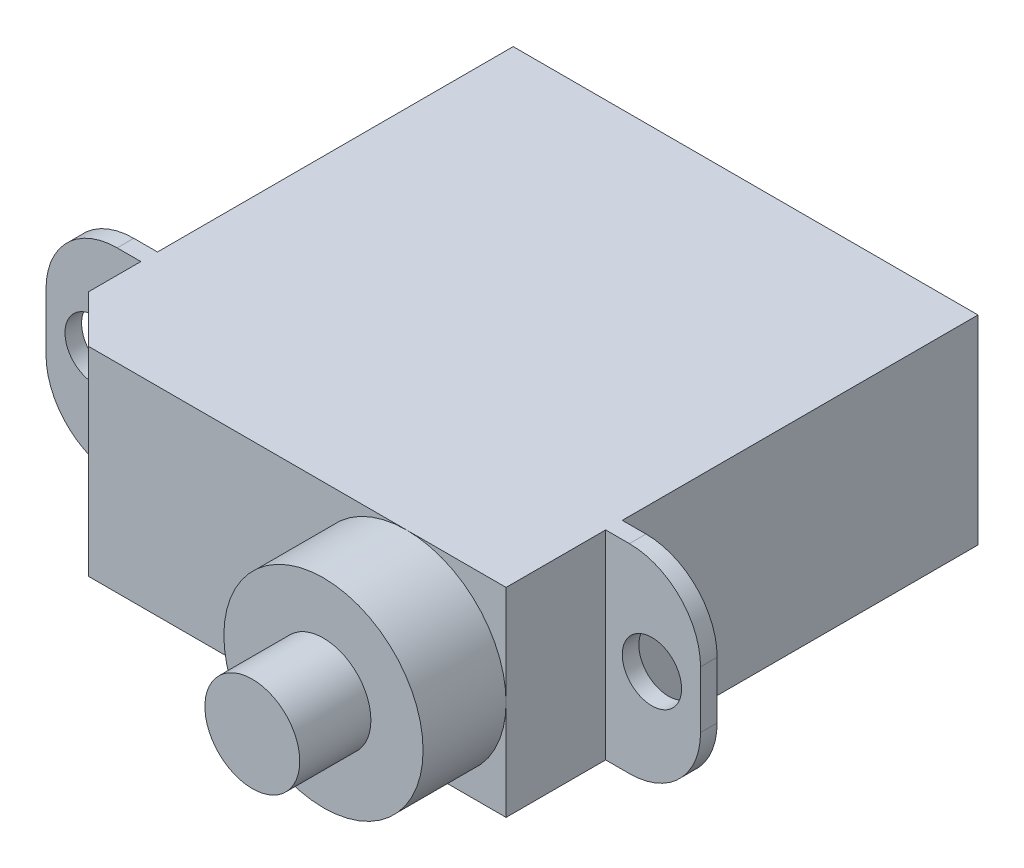
ISO-10303-21;
HEADER;
FILE_DESCRIPTION(('STEP AP214'),'2;1');
FILE_NAME('part.step','',(''),(''),'','','');
FILE_SCHEMA(('AUTOMOTIVE_DESIGN { 1 0 10303 214 1 1 1 1 }'));
ENDSEC;
DATA;
#1=APPLICATION_CONTEXT('core data for automotive mechanical design processes');
#2=APPLICATION_PROTOCOL_DEFINITION('international standard','automotive_design',2000,#1);
#3=PRODUCT_CONTEXT('',#1,'mechanical');
#4=PRODUCT('Part','Part','',(#3));
#5=PRODUCT_RELATED_PRODUCT_CATEGORY('part','',(#4));
#6=PRODUCT_DEFINITION_FORMATION('','',#4);
#7=PRODUCT_DEFINITION_CONTEXT('part definition',#1,'design');
#8=PRODUCT_DEFINITION('design','',#6,#7);
#9=PRODUCT_DEFINITION_SHAPE('','',#8);
#10=(LENGTH_UNIT() NAMED_UNIT(*) SI_UNIT(.MILLI.,.METRE.));
#11=(NAMED_UNIT(*) PLANE_ANGLE_UNIT() SI_UNIT($,.RADIAN.));
#12=(NAMED_UNIT(*) SI_UNIT($,.STERADIAN.) SOLID_ANGLE_UNIT());
#13=UNCERTAINTY_MEASURE_WITH_UNIT(LENGTH_MEASURE(1.E-05),#10,'distance_accuracy_value','');
#14=(GEOMETRIC_REPRESENTATION_CONTEXT(3) GLOBAL_UNCERTAINTY_ASSIGNED_CONTEXT((#13)) GLOBAL_UNIT_ASSIGNED_CONTEXT((#10,
#11,#12)) REPRESENTATION_CONTEXT('',''));
#15=CARTESIAN_POINT('',(0.,0.,0.));
#16=DIRECTION('',(0.,0.,1.));
#17=DIRECTION('',(1.,0.,0.));
#18=AXIS2_PLACEMENT_3D('',#15,#16,#17);
#19=CARTESIAN_POINT('',(5.6,0.,23.4));
#20=DIRECTION('',(0.,0.,1.));
#21=DIRECTION('',(1.,0.,0.));
#22=AXIS2_PLACEMENT_3D('',#19,#20,#21);
#23=PLANE('',#22);
#24=CARTESIAN_POINT('',(5.6,0.,23.4));
#25=DIRECTION('',(0.,0.,1.));
#26=DIRECTION('',(1.,0.,0.));
#27=AXIS2_PLACEMENT_3D('',#24,#25,#26);
#28=CIRCLE('',#27,4.2);
#29=CARTESIAN_POINT('',(9.8,0.,23.4));
#30=VERTEX_POINT('',#29);
#31=EDGE_CURVE('E184',#30,#30,#28,.T.);
#32=ORIENTED_EDGE('',*,*,#31,.T.);
#33=EDGE_LOOP('',(#32));
#34=FACE_BOUND('',#33,.T.);
#35=CARTESIAN_POINT('',(5.6,0.,23.4));
#36=DIRECTION('',(0.,0.,1.));
#37=DIRECTION('',(1.,0.,0.));
#38=AXIS2_PLACEMENT_3D('',#35,#36,#37);
#39=CIRCLE('',#38,2.);
#40=CARTESIAN_POINT('',(7.6,0.,23.4));
#41=VERTEX_POINT('',#40);
#42=EDGE_CURVE('E617',#41,#41,#39,.T.);
#43=ORIENTED_EDGE('',*,*,#42,.F.);
#44=EDGE_LOOP('',(#43));
#45=FACE_BOUND('',#44,.T.);
#46=ADVANCED_FACE('F33',(#34,#45),#23,.T.);
#47=CARTESIAN_POINT('',(9.8,-4.2,19.9));
#48=DIRECTION('',(0.,0.,1.));
#49=DIRECTION('',(1.,0.,0.));
#50=AXIS2_PLACEMENT_3D('',#47,#48,#49);
#51=PLANE('',#50);
#52=CARTESIAN_POINT('',(5.6,0.,19.9));
#53=DIRECTION('',(0.,0.,1.));
#54=DIRECTION('',(1.,0.,0.));
#55=AXIS2_PLACEMENT_3D('',#52,#53,#54);
#56=CIRCLE('',#55,4.2);
#57=CARTESIAN_POINT('',(9.8,0.,19.9));
#58=VERTEX_POINT('',#57);
#59=CARTESIAN_POINT('',(5.6,4.2,19.9));
#60=VERTEX_POINT('',#59);
#61=EDGE_CURVE('E44',#58,#60,#56,.T.);
#62=ORIENTED_EDGE('',*,*,#61,.F.);
#63=DIRECTION('',(0.,1.,0.));
#64=VECTOR('',#63,1.);
#65=CARTESIAN_POINT('',(9.8,4.2,19.9));
#66=LINE('',#65,#64);
#67=CARTESIAN_POINT('',(9.8,4.2,19.9));
#68=VERTEX_POINT('',#67);
#69=EDGE_CURVE('E168',#58,#68,#66,.T.);
#70=ORIENTED_EDGE('',*,*,#69,.T.);
#71=DIRECTION('',(-1.,0.,0.));
#72=VECTOR('',#71,1.);
#73=CARTESIAN_POINT('',(-9.8,4.2,19.9));
#74=LINE('',#73,#72);
#75=EDGE_CURVE('E182',#68,#60,#74,.T.);
#76=ORIENTED_EDGE('',*,*,#75,.T.);
#77=EDGE_LOOP('',(#62,#70,#76));
#78=FACE_BOUND('',#77,.T.);
#79=ADVANCED_FACE('F181',(#78),#51,.T.);
#80=CARTESIAN_POINT('',(5.6,-4.2,19.9));
#81=VERTEX_POINT('',#80);
#82=EDGE_CURVE('E11',#60,#81,#56,.T.);
#83=ORIENTED_EDGE('',*,*,#82,.F.);
#84=CARTESIAN_POINT('',(-7.80000000000001,4.2,19.9));
#85=VERTEX_POINT('',#84);
#86=EDGE_CURVE('E167',#60,#85,#74,.T.);
#87=ORIENTED_EDGE('',*,*,#86,.T.);
#88=DIRECTION('',(0.,-1.,0.));
#89=VECTOR('',#88,1.);
#90=CARTESIAN_POINT('',(-7.80000000000001,-4.2,19.9));
#91=LINE('',#90,#89);
#92=CARTESIAN_POINT('',(-7.80000000000001,-4.2,19.9));
#93=VERTEX_POINT('',#92);
#94=EDGE_CURVE('E264',#85,#93,#91,.T.);
#95=ORIENTED_EDGE('',*,*,#94,.T.);
#96=DIRECTION('',(1.,0.,0.));
#97=VECTOR('',#96,1.);
#98=CARTESIAN_POINT('',(-9.8,-4.2,19.9));
#99=LINE('',#98,#97);
#100=EDGE_CURVE('E239',#93,#81,#99,.T.);
#101=ORIENTED_EDGE('',*,*,#100,.T.);
#102=EDGE_LOOP('',(#83,#87,#95,#101));
#103=FACE_BOUND('',#102,.T.);
#104=ADVANCED_FACE('F381',(#103),#51,.T.);
#105=CARTESIAN_POINT('',(9.8,4.2,19.9));
#106=DIRECTION('',(-1.,0.,0.));
#107=DIRECTION('',(0.,-1.,0.));
#108=AXIS2_PLACEMENT_3D('',#105,#106,#107);
#109=PLANE('',#108);
#110=DIRECTION('',(0.,0.,-1.));
#111=VECTOR('',#110,1.);
#112=CARTESIAN_POINT('',(9.8,4.2,19.9));
#113=LINE('',#112,#111);
#114=CARTESIAN_POINT('',(9.8,4.2,15.));
#115=VERTEX_POINT('',#114);
#116=CARTESIAN_POINT('',(9.8,4.2,0.));
#117=VERTEX_POINT('',#116);
#118=EDGE_CURVE('E262',#115,#117,#113,.T.);
#119=ORIENTED_EDGE('',*,*,#118,.F.);
#120=DIRECTION('',(0.,-1.,0.));
#121=VECTOR('',#120,1.);
#122=CARTESIAN_POINT('',(9.8,4.2,15.));
#123=LINE('',#122,#121);
#124=CARTESIAN_POINT('',(9.79999999999999,-4.2,15.));
#125=VERTEX_POINT('',#124);
#126=EDGE_CURVE('E234',#115,#125,#123,.T.);
#127=ORIENTED_EDGE('',*,*,#126,.T.);
#128=DIRECTION('',(0.,0.,-1.));
#129=VECTOR('',#128,1.);
#130=CARTESIAN_POINT('',(9.8,-4.2,19.9));
#131=LINE('',#130,#129);
#132=CARTESIAN_POINT('',(9.8,-4.2,0.));
#133=VERTEX_POINT('',#132);
#134=EDGE_CURVE('E241',#125,#133,#131,.T.);
#135=ORIENTED_EDGE('',*,*,#134,.T.);
#136=DIRECTION('',(0.,1.,0.));
#137=VECTOR('',#136,1.);
#138=CARTESIAN_POINT('',(9.8,4.2,0.));
#139=LINE('',#138,#137);
#140=EDGE_CURVE('E236',#133,#117,#139,.T.);
#141=ORIENTED_EDGE('',*,*,#140,.T.);
#142=EDGE_LOOP('',(#119,#127,#135,#141));
#143=FACE_BOUND('',#142,.T.);
#144=ADVANCED_FACE('F358',(#143),#109,.F.);
#145=CARTESIAN_POINT('',(-9.8,4.2,19.9));
#146=DIRECTION('',(1.,0.,0.));
#147=DIRECTION('',(0.,1.,0.));
#148=AXIS2_PLACEMENT_3D('',#145,#146,#147);
#149=PLANE('',#148);
#150=DIRECTION('',(0.,0.,-1.));
#151=VECTOR('',#150,1.);
#152=CARTESIAN_POINT('',(-9.8,-4.2,19.9));
#153=LINE('',#152,#151);
#154=CARTESIAN_POINT('',(-9.8,-4.2,15.));
#155=VERTEX_POINT('',#154);
#156=CARTESIAN_POINT('',(-9.8,-4.2,0.));
#157=VERTEX_POINT('',#156);
#158=EDGE_CURVE('E254',#155,#157,#153,.T.);
#159=ORIENTED_EDGE('',*,*,#158,.F.);
#160=DIRECTION('',(0.,1.,0.));
#161=VECTOR('',#160,1.);
#162=CARTESIAN_POINT('',(-9.8,4.2,15.));
#163=LINE('',#162,#161);
#164=CARTESIAN_POINT('',(-9.8,4.2,15.));
#165=VERTEX_POINT('',#164);
#166=EDGE_CURVE('E231',#155,#165,#163,.T.);
#167=ORIENTED_EDGE('',*,*,#166,.T.);
#168=DIRECTION('',(0.,0.,-1.));
#169=VECTOR('',#168,1.);
#170=CARTESIAN_POINT('',(-9.8,4.2,19.9));
#171=LINE('',#170,#169);
#172=CARTESIAN_POINT('',(-9.8,4.2,0.));
#173=VERTEX_POINT('',#172);
#174=EDGE_CURVE('E258',#165,#173,#171,.T.);
#175=ORIENTED_EDGE('',*,*,#174,.T.);
#176=DIRECTION('',(0.,-1.,0.));
#177=VECTOR('',#176,1.);
#178=CARTESIAN_POINT('',(-9.8,4.2,0.));
#179=LINE('',#178,#177);
#180=EDGE_CURVE('E247',#173,#157,#179,.T.);
#181=ORIENTED_EDGE('',*,*,#180,.T.);
#182=EDGE_LOOP('',(#159,#167,#175,#181));
#183=FACE_BOUND('',#182,.T.);
#184=ADVANCED_FACE('F350',(#183),#149,.F.);
#185=CARTESIAN_POINT('',(9.8,-4.2,19.9));
#186=VERTEX_POINT('',#185);
#187=CARTESIAN_POINT('',(9.79999999999999,-4.2,15.7));
#188=VERTEX_POINT('',#187);
#189=EDGE_CURVE('E252',#186,#188,#131,.T.);
#190=ORIENTED_EDGE('',*,*,#189,.T.);
#191=DIRECTION('',(0.,1.,0.));
#192=VECTOR('',#191,1.);
#193=CARTESIAN_POINT('',(9.8,4.2,15.7));
#194=LINE('',#193,#192);
#195=CARTESIAN_POINT('',(9.8,4.2,15.7));
#196=VERTEX_POINT('',#195);
#197=EDGE_CURVE('E229',#188,#196,#194,.T.);
#198=ORIENTED_EDGE('',*,*,#197,.T.);
#199=EDGE_CURVE('E175',#68,#196,#113,.T.);
#200=ORIENTED_EDGE('',*,*,#199,.F.);
#201=ORIENTED_EDGE('',*,*,#69,.F.);
#202=EDGE_CURVE('E160',#186,#58,#66,.T.);
#203=ORIENTED_EDGE('',*,*,#202,.F.);
#204=EDGE_LOOP('',(#190,#198,#200,#201,#203));
#205=FACE_BOUND('',#204,.T.);
#206=ADVANCED_FACE('F172',(#205),#109,.F.);
#207=CARTESIAN_POINT('',(-9.8,4.2,19.9));
#208=DIRECTION('',(0.,-1.,0.));
#209=DIRECTION('',(0.,0.,-1.));
#210=AXIS2_PLACEMENT_3D('',#207,#208,#209);
#211=PLANE('',#210);
#212=DIRECTION('',(1.,0.,0.));
#213=VECTOR('',#212,1.);
#214=CARTESIAN_POINT('',(-13.8,4.2,15.7));
#215=LINE('',#214,#213);
#216=CARTESIAN_POINT('',(10.8,4.2,15.7));
#217=VERTEX_POINT('',#216);
#218=EDGE_CURVE('E206',#196,#217,#215,.T.);
#219=ORIENTED_EDGE('',*,*,#218,.T.);
#220=DIRECTION('',(0.,0.,-1.));
#221=VECTOR('',#220,1.);
#222=CARTESIAN_POINT('',(10.8,4.2,15.));
#223=LINE('',#222,#221);
#224=CARTESIAN_POINT('',(10.8,4.2,15.));
#225=VERTEX_POINT('',#224);
#226=EDGE_CURVE('E277',#217,#225,#223,.T.);
#227=ORIENTED_EDGE('',*,*,#226,.T.);
#228=DIRECTION('',(-1.,0.,0.));
#229=VECTOR('',#228,1.);
#230=CARTESIAN_POINT('',(-13.8,4.2,15.));
#231=LINE('',#230,#229);
#232=EDGE_CURVE('E204',#225,#115,#231,.T.);
#233=ORIENTED_EDGE('',*,*,#232,.T.);
#234=ORIENTED_EDGE('',*,*,#118,.T.);
#235=DIRECTION('',(-1.,0.,0.));
#236=VECTOR('',#235,1.);
#237=CARTESIAN_POINT('',(-9.8,4.2,0.));
#238=LINE('',#237,#236);
#239=EDGE_CURVE('E244',#117,#173,#238,.T.);
#240=ORIENTED_EDGE('',*,*,#239,.T.);
#241=ORIENTED_EDGE('',*,*,#174,.F.);
#242=CARTESIAN_POINT('',(-10.8,4.2,15.));
#243=VERTEX_POINT('',#242);
#244=EDGE_CURVE('E207',#165,#243,#231,.T.);
#245=ORIENTED_EDGE('',*,*,#244,.T.);
#246=DIRECTION('',(0.,0.,1.));
#247=VECTOR('',#246,1.);
#248=CARTESIAN_POINT('',(-10.8,4.2,15.7));
#249=LINE('',#248,#247);
#250=CARTESIAN_POINT('',(-10.8,4.2,15.7));
#251=VERTEX_POINT('',#250);
#252=EDGE_CURVE('E274',#243,#251,#249,.T.);
#253=ORIENTED_EDGE('',*,*,#252,.T.);
#254=CARTESIAN_POINT('',(-9.8,4.2,15.7));
#255=VERTEX_POINT('',#254);
#256=EDGE_CURVE('E225',#251,#255,#215,.T.);
#257=ORIENTED_EDGE('',*,*,#256,.T.);
#258=CARTESIAN_POINT('',(-9.8,4.2,17.9));
#259=VERTEX_POINT('',#258);
#260=EDGE_CURVE('E259',#259,#255,#171,.T.);
#261=ORIENTED_EDGE('',*,*,#260,.F.);
#262=DIRECTION('',(0.707106781186546,0.,0.707106781186549));
#263=VECTOR('',#262,1.);
#264=CARTESIAN_POINT('',(-7.80000000000001,4.2,19.9));
#265=LINE('',#264,#263);
#266=EDGE_CURVE('E271',#259,#85,#265,.T.);
#267=ORIENTED_EDGE('',*,*,#266,.T.);
#268=ORIENTED_EDGE('',*,*,#86,.F.);
#269=ORIENTED_EDGE('',*,*,#75,.F.);
#270=ORIENTED_EDGE('',*,*,#199,.T.);
#271=EDGE_LOOP('',(#219,#227,#233,#234,#240,#241,#245,#253,#257,#261,#267,#268,#269,#270));
#272=FACE_BOUND('',#271,.T.);
#273=ADVANCED_FACE('F340',(#272),#211,.F.);
#274=ORIENTED_EDGE('',*,*,#260,.T.);
#275=DIRECTION('',(0.,-1.,0.));
#276=VECTOR('',#275,1.);
#277=CARTESIAN_POINT('',(-9.8,4.2,15.7));
#278=LINE('',#277,#276);
#279=CARTESIAN_POINT('',(-9.8,-4.2,15.7));
#280=VERTEX_POINT('',#279);
#281=EDGE_CURVE('E227',#255,#280,#278,.T.);
#282=ORIENTED_EDGE('',*,*,#281,.T.);
#283=CARTESIAN_POINT('',(-9.8,-4.2,17.9));
#284=VERTEX_POINT('',#283);
#285=EDGE_CURVE('E255',#284,#280,#153,.T.);
#286=ORIENTED_EDGE('',*,*,#285,.F.);
#287=DIRECTION('',(0.,1.,0.));
#288=VECTOR('',#287,1.);
#289=CARTESIAN_POINT('',(-9.8,4.2,17.9));
#290=LINE('',#289,#288);
#291=EDGE_CURVE('E269',#284,#259,#290,.T.);
#292=ORIENTED_EDGE('',*,*,#291,.T.);
#293=EDGE_LOOP('',(#274,#282,#286,#292));
#294=FACE_BOUND('',#293,.T.);
#295=ADVANCED_FACE('F332',(#294),#149,.F.);
#296=CARTESIAN_POINT('',(-9.8,-4.2,19.9));
#297=DIRECTION('',(0.,1.,0.));
#298=DIRECTION('',(0.,0.,1.));
#299=AXIS2_PLACEMENT_3D('',#296,#297,#298);
#300=PLANE('',#299);
#301=DIRECTION('',(1.,0.,0.));
#302=VECTOR('',#301,1.);
#303=CARTESIAN_POINT('',(-13.8,-4.2,15.));
#304=LINE('',#303,#302);
#305=CARTESIAN_POINT('',(10.8,-4.2,15.));
#306=VERTEX_POINT('',#305);
#307=EDGE_CURVE('E210',#125,#306,#304,.T.);
#308=ORIENTED_EDGE('',*,*,#307,.T.);
#309=DIRECTION('',(0.,0.,1.));
#310=VECTOR('',#309,1.);
#311=CARTESIAN_POINT('',(10.8,-4.2,15.7));
#312=LINE('',#311,#310);
#313=CARTESIAN_POINT('',(10.8,-4.2,15.7));
#314=VERTEX_POINT('',#313);
#315=EDGE_CURVE('E295',#306,#314,#312,.T.);
#316=ORIENTED_EDGE('',*,*,#315,.T.);
#317=DIRECTION('',(-1.,0.,0.));
#318=VECTOR('',#317,1.);
#319=CARTESIAN_POINT('',(-13.8,-4.2,15.7));
#320=LINE('',#319,#318);
#321=EDGE_CURVE('E208',#314,#188,#320,.T.);
#322=ORIENTED_EDGE('',*,*,#321,.T.);
#323=ORIENTED_EDGE('',*,*,#189,.F.);
#324=EDGE_CURVE('E163',#81,#186,#99,.T.);
#325=ORIENTED_EDGE('',*,*,#324,.F.);
#326=ORIENTED_EDGE('',*,*,#100,.F.);
#327=DIRECTION('',(-0.707106781186546,0.,-0.707106781186549));
#328=VECTOR('',#327,1.);
#329=CARTESIAN_POINT('',(-7.80000000000001,-4.2,19.9));
#330=LINE('',#329,#328);
#331=EDGE_CURVE('E267',#93,#284,#330,.T.);
#332=ORIENTED_EDGE('',*,*,#331,.T.);
#333=ORIENTED_EDGE('',*,*,#285,.T.);
#334=CARTESIAN_POINT('',(-10.8,-4.2,15.7));
#335=VERTEX_POINT('',#334);
#336=EDGE_CURVE('E201',#280,#335,#320,.T.);
#337=ORIENTED_EDGE('',*,*,#336,.T.);
#338=DIRECTION('',(0.,0.,-1.));
#339=VECTOR('',#338,1.);
#340=CARTESIAN_POINT('',(-10.8,-4.2,15.));
#341=LINE('',#340,#339);
#342=CARTESIAN_POINT('',(-10.8,-4.2,15.));
#343=VERTEX_POINT('',#342);
#344=EDGE_CURVE('E292',#335,#343,#341,.T.);
#345=ORIENTED_EDGE('',*,*,#344,.T.);
#346=EDGE_CURVE('E211',#343,#155,#304,.T.);
#347=ORIENTED_EDGE('',*,*,#346,.T.);
#348=ORIENTED_EDGE('',*,*,#158,.T.);
#349=DIRECTION('',(1.,0.,0.));
#350=VECTOR('',#349,1.);
#351=CARTESIAN_POINT('',(-9.8,-4.2,0.));
#352=LINE('',#351,#350);
#353=EDGE_CURVE('E179',#157,#133,#352,.T.);
#354=ORIENTED_EDGE('',*,*,#353,.T.);
#355=ORIENTED_EDGE('',*,*,#134,.F.);
#356=EDGE_LOOP('',(#308,#316,#322,#323,#325,#326,#332,#333,#337,#345,#347,#348,#354,#355));
#357=FACE_BOUND('',#356,.T.);
#358=ADVANCED_FACE('F327',(#357),#300,.F.);
#359=EDGE_CURVE('E42',#81,#58,#56,.T.);
#360=ORIENTED_EDGE('',*,*,#359,.F.);
#361=ORIENTED_EDGE('',*,*,#324,.T.);
#362=ORIENTED_EDGE('',*,*,#202,.T.);
#363=EDGE_LOOP('',(#360,#361,#362));
#364=FACE_BOUND('',#363,.T.);
#365=ADVANCED_FACE('F162',(#364),#51,.T.);
#366=CARTESIAN_POINT('',(9.8,-4.2,0.));
#367=DIRECTION('',(0.,0.,1.));
#368=DIRECTION('',(1.,0.,0.));
#369=AXIS2_PLACEMENT_3D('',#366,#367,#368);
#370=PLANE('',#369);
#371=ORIENTED_EDGE('',*,*,#140,.F.);
#372=ORIENTED_EDGE('',*,*,#353,.F.);
#373=ORIENTED_EDGE('',*,*,#180,.F.);
#374=ORIENTED_EDGE('',*,*,#239,.F.);
#375=EDGE_LOOP('',(#371,#372,#373,#374));
#376=FACE_BOUND('',#375,.T.);
#377=ADVANCED_FACE('F355',(#376),#370,.F.);
#378=CARTESIAN_POINT('',(-7.80000000000001,-4.2,19.9));
#379=DIRECTION('',(-0.707106781186549,0.,0.707106781186546));
#380=DIRECTION('',(0.707106781186546,0.,0.707106781186549));
#381=AXIS2_PLACEMENT_3D('',#378,#379,#380);
#382=PLANE('',#381);
#383=ORIENTED_EDGE('',*,*,#266,.F.);
#384=ORIENTED_EDGE('',*,*,#291,.F.);
#385=ORIENTED_EDGE('',*,*,#331,.F.);
#386=ORIENTED_EDGE('',*,*,#94,.F.);
#387=EDGE_LOOP('',(#383,#384,#385,#386));
#388=FACE_BOUND('',#387,.T.);
#389=ADVANCED_FACE('F336',(#388),#382,.T.);
#390=CARTESIAN_POINT('',(-13.8,31.808875384557,15.7));
#391=DIRECTION('',(-1.,0.,0.));
#392=DIRECTION('',(0.,0.,1.));
#393=AXIS2_PLACEMENT_3D('',#390,#391,#392);
#394=PLANE('',#393);
#395=DIRECTION('',(0.,-1.,0.));
#396=VECTOR('',#395,1.);
#397=CARTESIAN_POINT('',(-13.8,31.808875384557,15.7));
#398=LINE('',#397,#396);
#399=CARTESIAN_POINT('',(-13.8,1.2,15.7));
#400=VERTEX_POINT('',#399);
#401=CARTESIAN_POINT('',(-13.8,-1.2,15.7));
#402=VERTEX_POINT('',#401);
#403=EDGE_CURVE('E220',#400,#402,#398,.T.);
#404=ORIENTED_EDGE('',*,*,#403,.F.);
#405=DIRECTION('',(0.,0.,1.));
#406=VECTOR('',#405,1.);
#407=CARTESIAN_POINT('',(-13.8,1.2,15.));
#408=LINE('',#407,#406);
#409=CARTESIAN_POINT('',(-13.8,1.2,15.));
#410=VERTEX_POINT('',#409);
#411=EDGE_CURVE('E304',#400,#410,#408,.F.);
#412=ORIENTED_EDGE('',*,*,#411,.T.);
#413=DIRECTION('',(0.,-1.,0.));
#414=VECTOR('',#413,1.);
#415=CARTESIAN_POINT('',(-13.8,31.808875384557,15.));
#416=LINE('',#415,#414);
#417=CARTESIAN_POINT('',(-13.8,-1.2,15.));
#418=VERTEX_POINT('',#417);
#419=EDGE_CURVE('E217',#410,#418,#416,.T.);
#420=ORIENTED_EDGE('',*,*,#419,.T.);
#421=DIRECTION('',(0.,0.,-1.));
#422=VECTOR('',#421,1.);
#423=CARTESIAN_POINT('',(-13.8,-1.2,15.7));
#424=LINE('',#423,#422);
#425=EDGE_CURVE('E302',#418,#402,#424,.F.);
#426=ORIENTED_EDGE('',*,*,#425,.T.);
#427=EDGE_LOOP('',(#404,#412,#420,#426));
#428=FACE_BOUND('',#427,.T.);
#429=ADVANCED_FACE('F316',(#428),#394,.T.);
#430=CARTESIAN_POINT('',(-13.8,31.808875384557,15.7));
#431=DIRECTION('',(0.,0.,1.));
#432=DIRECTION('',(1.,0.,0.));
#433=AXIS2_PLACEMENT_3D('',#430,#431,#432);
#434=PLANE('',#433);
#435=CARTESIAN_POINT('',(-11.75,0.,15.7));
#436=DIRECTION('',(0.,0.,1.));
#437=DIRECTION('',(1.,0.,0.));
#438=AXIS2_PLACEMENT_3D('',#435,#436,#437);
#439=CIRCLE('',#438,1.25);
#440=CARTESIAN_POINT('',(-10.5,0.,15.7));
#441=VERTEX_POINT('',#440);
#442=EDGE_CURVE('E198',#441,#441,#439,.T.);
#443=ORIENTED_EDGE('',*,*,#442,.F.);
#444=EDGE_LOOP('',(#443));
#445=FACE_BOUND('',#444,.T.);
#446=ORIENTED_EDGE('',*,*,#256,.F.);
#447=CARTESIAN_POINT('',(-10.8,1.2,15.7));
#448=DIRECTION('',(0.,0.,1.));
#449=DIRECTION('',(1.,0.,0.));
#450=AXIS2_PLACEMENT_3D('',#447,#448,#449);
#451=CIRCLE('',#450,3.);
#452=EDGE_CURVE('E300',#251,#400,#451,.T.);
#453=ORIENTED_EDGE('',*,*,#452,.T.);
#454=ORIENTED_EDGE('',*,*,#403,.T.);
#455=CARTESIAN_POINT('',(-10.8,-1.2,15.7));
#456=DIRECTION('',(0.,0.,1.));
#457=DIRECTION('',(1.,0.,0.));
#458=AXIS2_PLACEMENT_3D('',#455,#456,#457);
#459=CIRCLE('',#458,3.);
#460=EDGE_CURVE('E298',#402,#335,#459,.T.);
#461=ORIENTED_EDGE('',*,*,#460,.T.);
#462=ORIENTED_EDGE('',*,*,#336,.F.);
#463=ORIENTED_EDGE('',*,*,#281,.F.);
#464=EDGE_LOOP('',(#446,#453,#454,#461,#462,#463));
#465=FACE_BOUND('',#464,.T.);
#466=ADVANCED_FACE('F323',(#445,#465),#434,.T.);
#467=CARTESIAN_POINT('',(-13.8,31.808875384557,15.));
#468=DIRECTION('',(0.,0.,-1.));
#469=DIRECTION('',(-1.,0.,0.));
#470=AXIS2_PLACEMENT_3D('',#467,#468,#469);
#471=PLANE('',#470);
#472=CARTESIAN_POINT('',(-11.75,0.,15.));
#473=DIRECTION('',(0.,0.,-1.));
#474=DIRECTION('',(-1.,0.,0.));
#475=AXIS2_PLACEMENT_3D('',#472,#473,#474);
#476=CIRCLE('',#475,1.25);
#477=CARTESIAN_POINT('',(-13.,0.,15.));
#478=VERTEX_POINT('',#477);
#479=EDGE_CURVE('E194',#478,#478,#476,.F.);
#480=ORIENTED_EDGE('',*,*,#479,.T.);
#481=EDGE_LOOP('',(#480));
#482=FACE_BOUND('',#481,.T.);
#483=ORIENTED_EDGE('',*,*,#419,.F.);
#484=CARTESIAN_POINT('',(-10.8,1.2,15.));
#485=DIRECTION('',(0.,0.,-1.));
#486=DIRECTION('',(-1.,0.,0.));
#487=AXIS2_PLACEMENT_3D('',#484,#485,#486);
#488=CIRCLE('',#487,3.);
#489=EDGE_CURVE('E37',#410,#243,#488,.T.);
#490=ORIENTED_EDGE('',*,*,#489,.T.);
#491=ORIENTED_EDGE('',*,*,#244,.F.);
#492=ORIENTED_EDGE('',*,*,#166,.F.);
#493=ORIENTED_EDGE('',*,*,#346,.F.);
#494=CARTESIAN_POINT('',(-10.8,-1.2,15.));
#495=DIRECTION('',(0.,0.,-1.));
#496=DIRECTION('',(-1.,0.,0.));
#497=AXIS2_PLACEMENT_3D('',#494,#495,#496);
#498=CIRCLE('',#497,3.);
#499=EDGE_CURVE('E187',#343,#418,#498,.T.);
#500=ORIENTED_EDGE('',*,*,#499,.T.);
#501=EDGE_LOOP('',(#483,#490,#491,#492,#493,#500));
#502=FACE_BOUND('',#501,.T.);
#503=ADVANCED_FACE('F308',(#482,#502),#471,.T.);
#504=CARTESIAN_POINT('',(11.75,0.,15.));
#505=DIRECTION('',(0.,0.,-1.));
#506=DIRECTION('',(-1.,0.,0.));
#507=AXIS2_PLACEMENT_3D('',#504,#505,#506);
#508=CIRCLE('',#507,1.25);
#509=CARTESIAN_POINT('',(10.5,0.,15.));
#510=VERTEX_POINT('',#509);
#511=EDGE_CURVE('E195',#510,#510,#508,.F.);
#512=ORIENTED_EDGE('',*,*,#511,.T.);
#513=EDGE_LOOP('',(#512));
#514=FACE_BOUND('',#513,.T.);
#515=ORIENTED_EDGE('',*,*,#232,.F.);
#516=CARTESIAN_POINT('',(10.8,1.2,15.));
#517=DIRECTION('',(0.,0.,-1.));
#518=DIRECTION('',(-1.,0.,0.));
#519=AXIS2_PLACEMENT_3D('',#516,#517,#518);
#520=CIRCLE('',#519,3.);
#521=CARTESIAN_POINT('',(13.8,1.2,15.));
#522=VERTEX_POINT('',#521);
#523=EDGE_CURVE('E282',#225,#522,#520,.T.);
#524=ORIENTED_EDGE('',*,*,#523,.T.);
#525=DIRECTION('',(0.,-1.,0.));
#526=VECTOR('',#525,1.);
#527=CARTESIAN_POINT('',(13.8,31.808875384557,15.));
#528=LINE('',#527,#526);
#529=CARTESIAN_POINT('',(13.8,-1.2,15.));
#530=VERTEX_POINT('',#529);
#531=EDGE_CURVE('E214',#522,#530,#528,.T.);
#532=ORIENTED_EDGE('',*,*,#531,.T.);
#533=CARTESIAN_POINT('',(10.8,-1.2,15.));
#534=DIRECTION('',(0.,0.,-1.));
#535=DIRECTION('',(-1.,0.,0.));
#536=AXIS2_PLACEMENT_3D('',#533,#534,#535);
#537=CIRCLE('',#536,3.);
#538=EDGE_CURVE('E280',#530,#306,#537,.T.);
#539=ORIENTED_EDGE('',*,*,#538,.T.);
#540=ORIENTED_EDGE('',*,*,#307,.F.);
#541=ORIENTED_EDGE('',*,*,#126,.F.);
#542=EDGE_LOOP('',(#515,#524,#532,#539,#540,#541));
#543=FACE_BOUND('',#542,.T.);
#544=ADVANCED_FACE('F362',(#514,#543),#471,.T.);
#545=CARTESIAN_POINT('',(11.75,0.,15.7));
#546=DIRECTION('',(0.,0.,1.));
#547=DIRECTION('',(1.,0.,0.));
#548=AXIS2_PLACEMENT_3D('',#545,#546,#547);
#549=CIRCLE('',#548,1.25);
#550=CARTESIAN_POINT('',(13.,0.,15.7));
#551=VERTEX_POINT('',#550);
#552=EDGE_CURVE('E191',#551,#551,#549,.T.);
#553=ORIENTED_EDGE('',*,*,#552,.F.);
#554=EDGE_LOOP('',(#553));
#555=FACE_BOUND('',#554,.T.);
#556=DIRECTION('',(0.,-1.,0.));
#557=VECTOR('',#556,1.);
#558=CARTESIAN_POINT('',(13.8,31.808875384557,15.7));
#559=LINE('',#558,#557);
#560=CARTESIAN_POINT('',(13.8,1.2,15.7));
#561=VERTEX_POINT('',#560);
#562=CARTESIAN_POINT('',(13.8,-1.2,15.7));
#563=VERTEX_POINT('',#562);
#564=EDGE_CURVE('E213',#561,#563,#559,.T.);
#565=ORIENTED_EDGE('',*,*,#564,.F.);
#566=CARTESIAN_POINT('',(10.8,1.2,15.7));
#567=DIRECTION('',(0.,0.,1.));
#568=DIRECTION('',(1.,0.,0.));
#569=AXIS2_PLACEMENT_3D('',#566,#567,#568);
#570=CIRCLE('',#569,3.);
#571=EDGE_CURVE('E290',#561,#217,#570,.T.);
#572=ORIENTED_EDGE('',*,*,#571,.T.);
#573=ORIENTED_EDGE('',*,*,#218,.F.);
#574=ORIENTED_EDGE('',*,*,#197,.F.);
#575=ORIENTED_EDGE('',*,*,#321,.F.);
#576=CARTESIAN_POINT('',(10.8,-1.2,15.7));
#577=DIRECTION('',(0.,0.,1.));
#578=DIRECTION('',(1.,0.,0.));
#579=AXIS2_PLACEMENT_3D('',#576,#577,#578);
#580=CIRCLE('',#579,3.);
#581=EDGE_CURVE('E288',#314,#563,#580,.T.);
#582=ORIENTED_EDGE('',*,*,#581,.T.);
#583=EDGE_LOOP('',(#565,#572,#573,#574,#575,#582));
#584=FACE_BOUND('',#583,.T.);
#585=ADVANCED_FACE('F371',(#555,#584),#434,.T.);
#586=CARTESIAN_POINT('',(13.8,31.808875384557,15.7));
#587=DIRECTION('',(1.,0.,0.));
#588=DIRECTION('',(0.,0.,-1.));
#589=AXIS2_PLACEMENT_3D('',#586,#587,#588);
#590=PLANE('',#589);
#591=ORIENTED_EDGE('',*,*,#531,.F.);
#592=DIRECTION('',(0.,0.,-1.));
#593=VECTOR('',#592,1.);
#594=CARTESIAN_POINT('',(13.8,1.2,15.7));
#595=LINE('',#594,#593);
#596=EDGE_CURVE('E286',#522,#561,#595,.F.);
#597=ORIENTED_EDGE('',*,*,#596,.T.);
#598=ORIENTED_EDGE('',*,*,#564,.T.);
#599=DIRECTION('',(0.,0.,1.));
#600=VECTOR('',#599,1.);
#601=CARTESIAN_POINT('',(13.8,-1.2,15.));
#602=LINE('',#601,#600);
#603=EDGE_CURVE('E284',#563,#530,#602,.F.);
#604=ORIENTED_EDGE('',*,*,#603,.T.);
#605=EDGE_LOOP('',(#591,#597,#598,#604));
#606=FACE_BOUND('',#605,.T.);
#607=ADVANCED_FACE('F376',(#606),#590,.T.);
#608=CARTESIAN_POINT('',(10.8,1.2,19.9));
#609=DIRECTION('',(0.,0.,1.));
#610=DIRECTION('',(1.,0.,0.));
#611=AXIS2_PLACEMENT_3D('',#608,#609,#610);
#612=CYLINDRICAL_SURFACE('',#611,3.);
#613=ORIENTED_EDGE('',*,*,#571,.F.);
#614=ORIENTED_EDGE('',*,*,#596,.F.);
#615=ORIENTED_EDGE('',*,*,#523,.F.);
#616=ORIENTED_EDGE('',*,*,#226,.F.);
#617=EDGE_LOOP('',(#613,#614,#615,#616));
#618=FACE_BOUND('',#617,.T.);
#619=ADVANCED_FACE('F379',(#618),#612,.T.);
#620=CARTESIAN_POINT('',(10.8,-1.2,19.9));
#621=DIRECTION('',(0.,0.,-1.));
#622=DIRECTION('',(-1.,0.,0.));
#623=AXIS2_PLACEMENT_3D('',#620,#621,#622);
#624=CYLINDRICAL_SURFACE('',#623,3.);
#625=ORIENTED_EDGE('',*,*,#538,.F.);
#626=ORIENTED_EDGE('',*,*,#603,.F.);
#627=ORIENTED_EDGE('',*,*,#581,.F.);
#628=ORIENTED_EDGE('',*,*,#315,.F.);
#629=EDGE_LOOP('',(#625,#626,#627,#628));
#630=FACE_BOUND('',#629,.T.);
#631=ADVANCED_FACE('F367',(#630),#624,.T.);
#632=CARTESIAN_POINT('',(-10.8,1.2,19.9));
#633=DIRECTION('',(0.,0.,-1.));
#634=DIRECTION('',(-1.,0.,0.));
#635=AXIS2_PLACEMENT_3D('',#632,#633,#634);
#636=CYLINDRICAL_SURFACE('',#635,3.);
#637=ORIENTED_EDGE('',*,*,#489,.F.);
#638=ORIENTED_EDGE('',*,*,#411,.F.);
#639=ORIENTED_EDGE('',*,*,#452,.F.);
#640=ORIENTED_EDGE('',*,*,#252,.F.);
#641=EDGE_LOOP('',(#637,#638,#639,#640));
#642=FACE_BOUND('',#641,.T.);
#643=ADVANCED_FACE('F343',(#642),#636,.T.);
#644=CARTESIAN_POINT('',(-10.8,-1.2,19.9));
#645=DIRECTION('',(0.,0.,1.));
#646=DIRECTION('',(1.,0.,0.));
#647=AXIS2_PLACEMENT_3D('',#644,#645,#646);
#648=CYLINDRICAL_SURFACE('',#647,3.);
#649=ORIENTED_EDGE('',*,*,#460,.F.);
#650=ORIENTED_EDGE('',*,*,#425,.F.);
#651=ORIENTED_EDGE('',*,*,#499,.F.);
#652=ORIENTED_EDGE('',*,*,#344,.F.);
#653=EDGE_LOOP('',(#649,#650,#651,#652));
#654=FACE_BOUND('',#653,.T.);
#655=ADVANCED_FACE('F35',(#654),#648,.T.);
#656=CARTESIAN_POINT('',(-11.75,0.,-0.001000000000001));
#657=DIRECTION('',(0.,0.,1.));
#658=DIRECTION('',(1.,0.,0.));
#659=AXIS2_PLACEMENT_3D('',#656,#657,#658);
#660=CYLINDRICAL_SURFACE('',#659,1.25);
#661=ORIENTED_EDGE('',*,*,#479,.F.);
#662=EDGE_LOOP('',(#661));
#663=FACE_BOUND('',#662,.T.);
#664=ORIENTED_EDGE('',*,*,#442,.T.);
#665=EDGE_LOOP('',(#664));
#666=FACE_BOUND('',#665,.T.);
#667=ADVANCED_FACE('F409',(#663,#666),#660,.F.);
#668=CARTESIAN_POINT('',(11.75,0.,-0.001000000000001));
#669=DIRECTION('',(0.,0.,1.));
#670=DIRECTION('',(1.,0.,0.));
#671=AXIS2_PLACEMENT_3D('',#668,#669,#670);
#672=CYLINDRICAL_SURFACE('',#671,1.25);
#673=ORIENTED_EDGE('',*,*,#511,.F.);
#674=EDGE_LOOP('',(#673));
#675=FACE_BOUND('',#674,.T.);
#676=ORIENTED_EDGE('',*,*,#552,.T.);
#677=EDGE_LOOP('',(#676));
#678=FACE_BOUND('',#677,.T.);
#679=ADVANCED_FACE('F405',(#675,#678),#672,.F.);
#680=CARTESIAN_POINT('',(5.6,0.,23.4));
#681=DIRECTION('',(0.,0.,-1.));
#682=DIRECTION('',(-1.,0.,0.));
#683=AXIS2_PLACEMENT_3D('',#680,#681,#682);
#684=CYLINDRICAL_SURFACE('',#683,4.2);
#685=ORIENTED_EDGE('',*,*,#31,.F.);
#686=EDGE_LOOP('',(#685));
#687=FACE_BOUND('',#686,.T.);
#688=ORIENTED_EDGE('',*,*,#61,.T.);
#689=ORIENTED_EDGE('',*,*,#82,.T.);
#690=ORIENTED_EDGE('',*,*,#359,.T.);
#691=EDGE_LOOP('',(#688,#689,#690));
#692=FACE_BOUND('',#691,.T.);
#693=ADVANCED_FACE('F186',(#687,#692),#684,.T.);
#694=CARTESIAN_POINT('',(5.6,0.,26.4));
#695=DIRECTION('',(0.,0.,-1.));
#696=DIRECTION('',(-1.,0.,0.));
#697=AXIS2_PLACEMENT_3D('',#694,#695,#696);
#698=CYLINDRICAL_SURFACE('',#697,2.);
#699=CARTESIAN_POINT('',(5.6,0.,26.4));
#700=DIRECTION('',(0.,0.,1.));
#701=DIRECTION('',(1.,0.,0.));
#702=AXIS2_PLACEMENT_3D('',#699,#700,#701);
#703=CIRCLE('',#702,2.);
#704=CARTESIAN_POINT('',(7.6,0.,26.4));
#705=VERTEX_POINT('',#704);
#706=EDGE_CURVE('E185',#705,#705,#703,.T.);
#707=ORIENTED_EDGE('',*,*,#706,.F.);
#708=EDGE_LOOP('',(#707));
#709=FACE_BOUND('',#708,.T.);
#710=ORIENTED_EDGE('',*,*,#42,.T.);
#711=EDGE_LOOP('',(#710));
#712=FACE_BOUND('',#711,.T.);
#713=ADVANCED_FACE('F401',(#709,#712),#698,.T.);
#714=CARTESIAN_POINT('',(5.6,0.,26.4));
#715=DIRECTION('',(0.,0.,1.));
#716=DIRECTION('',(1.,0.,0.));
#717=AXIS2_PLACEMENT_3D('',#714,#715,#716);
#718=PLANE('',#717);
#719=ORIENTED_EDGE('',*,*,#706,.T.);
#720=EDGE_LOOP('',(#719));
#721=FACE_BOUND('',#720,.T.);
#722=ADVANCED_FACE('F459',(#721),#718,.T.);
#723=CLOSED_SHELL('',(#46,#79,#104,#144,#184,#206,#273,#295,#358,#365,#377,#389,#429,#466,#503,
#544,#585,#607,#619,#631,#643,#655,#667,#679,#693,#713,#722));
#724=MANIFOLD_SOLID_BREP('B2',#723);
#725=ADVANCED_BREP_SHAPE_REPRESENTATION('',(#18,#724),#14);
#726=SHAPE_DEFINITION_REPRESENTATION(#9,#725);
ENDSEC;
END-ISO-10303-21;
